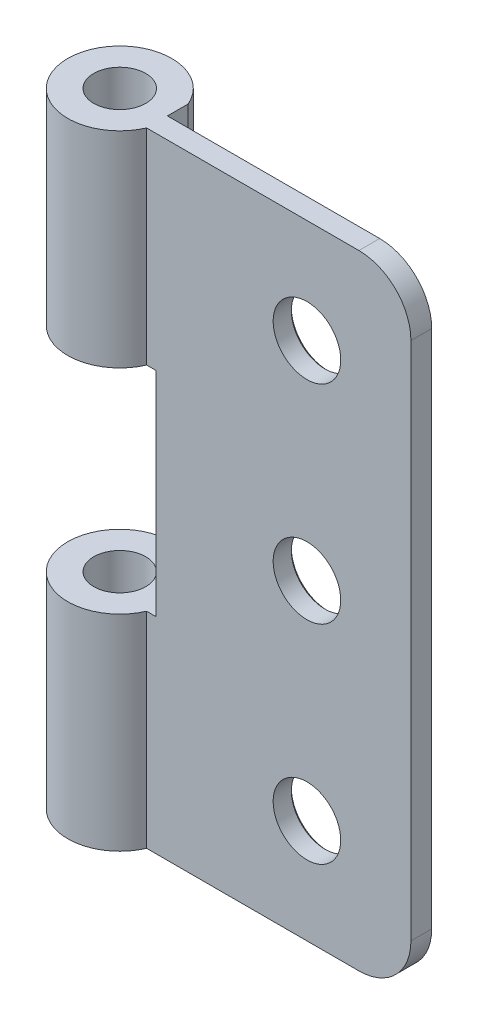
ISO-10303-21;
HEADER;
FILE_DESCRIPTION(('STEP AP214'),'2;1');
FILE_NAME('part.step','',(''),(''),'','','');
FILE_SCHEMA(('AUTOMOTIVE_DESIGN { 1 0 10303 214 1 1 1 1 }'));
ENDSEC;
DATA;
#1=APPLICATION_CONTEXT('core data for automotive mechanical design processes');
#2=APPLICATION_PROTOCOL_DEFINITION('international standard','automotive_design',2000,#1);
#3=PRODUCT_CONTEXT('',#1,'mechanical');
#4=PRODUCT('Part','Part','',(#3));
#5=PRODUCT_RELATED_PRODUCT_CATEGORY('part','',(#4));
#6=PRODUCT_DEFINITION_FORMATION('','',#4);
#7=PRODUCT_DEFINITION_CONTEXT('part definition',#1,'design');
#8=PRODUCT_DEFINITION('design','',#6,#7);
#9=PRODUCT_DEFINITION_SHAPE('','',#8);
#10=(LENGTH_UNIT() NAMED_UNIT(*) SI_UNIT(.MILLI.,.METRE.));
#11=(NAMED_UNIT(*) PLANE_ANGLE_UNIT() SI_UNIT($,.RADIAN.));
#12=(NAMED_UNIT(*) SI_UNIT($,.STERADIAN.) SOLID_ANGLE_UNIT());
#13=UNCERTAINTY_MEASURE_WITH_UNIT(LENGTH_MEASURE(1.E-05),#10,'distance_accuracy_value','');
#14=(GEOMETRIC_REPRESENTATION_CONTEXT(3) GLOBAL_UNCERTAINTY_ASSIGNED_CONTEXT((#13)) GLOBAL_UNIT_ASSIGNED_CONTEXT((#10,
#11,#12)) REPRESENTATION_CONTEXT('',''));
#15=CARTESIAN_POINT('',(0.,0.,0.));
#16=DIRECTION('',(0.,0.,1.));
#17=DIRECTION('',(1.,0.,0.));
#18=AXIS2_PLACEMENT_3D('',#15,#16,#17);
#19=CARTESIAN_POINT('',(0.,30.,0.));
#20=DIRECTION('',(0.,0.,-1.));
#21=DIRECTION('',(-1.,0.,0.));
#22=AXIS2_PLACEMENT_3D('',#19,#20,#21);
#23=PLANE('',#22);
#24=CARTESIAN_POINT('',(20.,-20.,0.));
#25=DIRECTION('',(0.,0.,-1.));
#26=DIRECTION('',(-1.,0.,0.));
#27=AXIS2_PLACEMENT_3D('',#24,#25,#26);
#28=CIRCLE('',#27,3.5);
#29=CARTESIAN_POINT('',(16.5,-20.,0.));
#30=VERTEX_POINT('',#29);
#31=EDGE_CURVE('E318',#30,#30,#28,.T.);
#32=ORIENTED_EDGE('',*,*,#31,.F.);
#33=EDGE_LOOP('',(#32));
#34=FACE_BOUND('',#33,.T.);
#35=CARTESIAN_POINT('',(20.,0.,0.));
#36=DIRECTION('',(0.,0.,-1.));
#37=DIRECTION('',(-1.,0.,0.));
#38=AXIS2_PLACEMENT_3D('',#35,#36,#37);
#39=CIRCLE('',#38,3.5);
#40=CARTESIAN_POINT('',(16.5,0.,0.));
#41=VERTEX_POINT('',#40);
#42=EDGE_CURVE('E171',#41,#41,#39,.T.);
#43=ORIENTED_EDGE('',*,*,#42,.F.);
#44=EDGE_LOOP('',(#43));
#45=FACE_BOUND('',#44,.T.);
#46=CARTESIAN_POINT('',(20.,20.,0.));
#47=DIRECTION('',(0.,0.,-1.));
#48=DIRECTION('',(-1.,0.,0.));
#49=AXIS2_PLACEMENT_3D('',#46,#47,#48);
#50=CIRCLE('',#49,3.5);
#51=CARTESIAN_POINT('',(16.5,20.,0.));
#52=VERTEX_POINT('',#51);
#53=EDGE_CURVE('E166',#52,#52,#50,.T.);
#54=ORIENTED_EDGE('',*,*,#53,.F.);
#55=EDGE_LOOP('',(#54));
#56=FACE_BOUND('',#55,.T.);
#57=DIRECTION('',(1.,0.,0.));
#58=VECTOR('',#57,1.);
#59=CARTESIAN_POINT('',(0.,30.,0.));
#60=LINE('',#59,#58);
#61=CARTESIAN_POINT('',(4.58257569495584,30.,0.));
#62=VERTEX_POINT('',#61);
#63=CARTESIAN_POINT('',(25.,30.,0.));
#64=VERTEX_POINT('',#63);
#65=EDGE_CURVE('E185',#62,#64,#60,.T.);
#66=ORIENTED_EDGE('',*,*,#65,.T.);
#67=CARTESIAN_POINT('',(25.,25.,0.));
#68=DIRECTION('',(0.,0.,-1.));
#69=DIRECTION('',(-1.,0.,0.));
#70=AXIS2_PLACEMENT_3D('',#67,#68,#69);
#71=CIRCLE('',#70,5.);
#72=CARTESIAN_POINT('',(30.,25.,0.));
#73=VERTEX_POINT('',#72);
#74=EDGE_CURVE('E42',#64,#73,#71,.T.);
#75=ORIENTED_EDGE('',*,*,#74,.T.);
#76=DIRECTION('',(0.,-1.,0.));
#77=VECTOR('',#76,1.);
#78=CARTESIAN_POINT('',(30.,30.,0.));
#79=LINE('',#78,#77);
#80=CARTESIAN_POINT('',(30.,-25.,0.));
#81=VERTEX_POINT('',#80);
#82=EDGE_CURVE('E184',#73,#81,#79,.T.);
#83=ORIENTED_EDGE('',*,*,#82,.T.);
#84=CARTESIAN_POINT('',(25.,-25.,0.));
#85=DIRECTION('',(0.,0.,-1.));
#86=DIRECTION('',(-1.,0.,0.));
#87=AXIS2_PLACEMENT_3D('',#84,#85,#86);
#88=CIRCLE('',#87,5.);
#89=CARTESIAN_POINT('',(25.,-30.,0.));
#90=VERTEX_POINT('',#89);
#91=EDGE_CURVE('E49',#81,#90,#88,.T.);
#92=ORIENTED_EDGE('',*,*,#91,.T.);
#93=DIRECTION('',(1.,0.,0.));
#94=VECTOR('',#93,1.);
#95=CARTESIAN_POINT('',(0.,-30.,0.));
#96=LINE('',#95,#94);
#97=CARTESIAN_POINT('',(4.58257569495584,-30.,0.));
#98=VERTEX_POINT('',#97);
#99=EDGE_CURVE('E147',#98,#90,#96,.T.);
#100=ORIENTED_EDGE('',*,*,#99,.F.);
#101=DIRECTION('',(0.,-1.,0.));
#102=VECTOR('',#101,1.);
#103=CARTESIAN_POINT('',(4.58257569495584,30.,0.));
#104=LINE('',#103,#102);
#105=CARTESIAN_POINT('',(4.58257569495584,-10.25,0.));
#106=VERTEX_POINT('',#105);
#107=EDGE_CURVE('E143',#106,#98,#104,.T.);
#108=ORIENTED_EDGE('',*,*,#107,.F.);
#109=DIRECTION('',(1.,0.,0.));
#110=VECTOR('',#109,1.);
#111=CARTESIAN_POINT('',(0.,-10.25,0.));
#112=LINE('',#111,#110);
#113=CARTESIAN_POINT('',(5.5,-10.25,0.));
#114=VERTEX_POINT('',#113);
#115=EDGE_CURVE('E126',#106,#114,#112,.T.);
#116=ORIENTED_EDGE('',*,*,#115,.T.);
#117=DIRECTION('',(0.,1.,0.));
#118=VECTOR('',#117,1.);
#119=CARTESIAN_POINT('',(5.5,-10.25,0.));
#120=LINE('',#119,#118);
#121=CARTESIAN_POINT('',(5.5,10.25,0.));
#122=VERTEX_POINT('',#121);
#123=EDGE_CURVE('E217',#114,#122,#120,.T.);
#124=ORIENTED_EDGE('',*,*,#123,.T.);
#125=DIRECTION('',(1.,0.,0.));
#126=VECTOR('',#125,1.);
#127=CARTESIAN_POINT('',(0.,10.25,0.));
#128=LINE('',#127,#126);
#129=CARTESIAN_POINT('',(4.58257569495584,10.25,0.));
#130=VERTEX_POINT('',#129);
#131=EDGE_CURVE('E161',#130,#122,#128,.T.);
#132=ORIENTED_EDGE('',*,*,#131,.F.);
#133=EDGE_CURVE('E149',#62,#130,#104,.T.);
#134=ORIENTED_EDGE('',*,*,#133,.F.);
#135=EDGE_LOOP('',(#66,#75,#83,#92,#100,#108,#116,#124,#132,#134));
#136=FACE_BOUND('',#135,.T.);
#137=ADVANCED_FACE('F34',(#34,#45,#56,#136),#23,.T.);
#138=CARTESIAN_POINT('',(4.58257569495584,30.,0.));
#139=DIRECTION('',(1.,0.,0.));
#140=DIRECTION('',(0.,0.,-1.));
#141=AXIS2_PLACEMENT_3D('',#138,#139,#140);
#142=PLANE('',#141);
#143=DIRECTION('',(0.,-1.,0.));
#144=VECTOR('',#143,1.);
#145=CARTESIAN_POINT('',(4.58257569495584,30.,-2.));
#146=LINE('',#145,#144);
#147=CARTESIAN_POINT('',(4.58257569495584,-10.25,-2.));
#148=VERTEX_POINT('',#147);
#149=CARTESIAN_POINT('',(4.58257569495584,-30.,-2.));
#150=VERTEX_POINT('',#149);
#151=EDGE_CURVE('E144',#148,#150,#146,.T.);
#152=ORIENTED_EDGE('',*,*,#151,.F.);
#153=DIRECTION('',(0.,0.,1.));
#154=VECTOR('',#153,1.);
#155=CARTESIAN_POINT('',(4.58257569495584,-10.25,0.));
#156=LINE('',#155,#154);
#157=EDGE_CURVE('E130',#148,#106,#156,.T.);
#158=ORIENTED_EDGE('',*,*,#157,.T.);
#159=ORIENTED_EDGE('',*,*,#107,.T.);
#160=DIRECTION('',(0.,0.,1.));
#161=VECTOR('',#160,1.);
#162=CARTESIAN_POINT('',(4.58257569495584,-30.,0.));
#163=LINE('',#162,#161);
#164=EDGE_CURVE('E216',#150,#98,#163,.T.);
#165=ORIENTED_EDGE('',*,*,#164,.F.);
#166=EDGE_LOOP('',(#152,#158,#159,#165));
#167=FACE_BOUND('',#166,.T.);
#168=ADVANCED_FACE('F141',(#167),#142,.T.);
#169=CARTESIAN_POINT('',(0.,30.,0.));
#170=DIRECTION('',(0.,-1.,0.));
#171=DIRECTION('',(0.,0.,-1.));
#172=AXIS2_PLACEMENT_3D('',#169,#170,#171);
#173=CYLINDRICAL_SURFACE('',#172,5.);
#174=CARTESIAN_POINT('',(0.,-10.25,0.));
#175=DIRECTION('',(0.,1.,0.));
#176=DIRECTION('',(0.,0.,1.));
#177=AXIS2_PLACEMENT_3D('',#174,#175,#176);
#178=CIRCLE('',#177,5.);
#179=CARTESIAN_POINT('',(4.58257569495584,-10.25,2.));
#180=VERTEX_POINT('',#179);
#181=EDGE_CURVE('E145',#148,#180,#178,.T.);
#182=ORIENTED_EDGE('',*,*,#181,.F.);
#183=ORIENTED_EDGE('',*,*,#151,.T.);
#184=CARTESIAN_POINT('',(0.,-30.,0.));
#185=DIRECTION('',(0.,1.,0.));
#186=DIRECTION('',(0.,0.,1.));
#187=AXIS2_PLACEMENT_3D('',#184,#185,#186);
#188=CIRCLE('',#187,5.);
#189=CARTESIAN_POINT('',(4.58257569495584,-30.,2.));
#190=VERTEX_POINT('',#189);
#191=EDGE_CURVE('E219',#150,#190,#188,.T.);
#192=ORIENTED_EDGE('',*,*,#191,.T.);
#193=DIRECTION('',(0.,-1.,0.));
#194=VECTOR('',#193,1.);
#195=CARTESIAN_POINT('',(4.58257569495584,30.,2.));
#196=LINE('',#195,#194);
#197=EDGE_CURVE('E227',#180,#190,#196,.T.);
#198=ORIENTED_EDGE('',*,*,#197,.F.);
#199=EDGE_LOOP('',(#182,#183,#192,#198));
#200=FACE_BOUND('',#199,.T.);
#201=ADVANCED_FACE('F238',(#200),#173,.T.);
#202=CARTESIAN_POINT('',(0.,30.,2.));
#203=DIRECTION('',(0.,0.,1.));
#204=DIRECTION('',(1.,0.,0.));
#205=AXIS2_PLACEMENT_3D('',#202,#203,#204);
#206=PLANE('',#205);
#207=CARTESIAN_POINT('',(20.,-20.,2.));
#208=DIRECTION('',(0.,0.,1.));
#209=DIRECTION('',(1.,0.,0.));
#210=AXIS2_PLACEMENT_3D('',#207,#208,#209);
#211=CIRCLE('',#210,3.25);
#212=CARTESIAN_POINT('',(23.25,-20.,2.));
#213=VERTEX_POINT('',#212);
#214=EDGE_CURVE('E168',#213,#213,#211,.T.);
#215=ORIENTED_EDGE('',*,*,#214,.F.);
#216=EDGE_LOOP('',(#215));
#217=FACE_BOUND('',#216,.T.);
#218=CARTESIAN_POINT('',(20.,0.,2.));
#219=DIRECTION('',(0.,0.,1.));
#220=DIRECTION('',(1.,0.,0.));
#221=AXIS2_PLACEMENT_3D('',#218,#219,#220);
#222=CIRCLE('',#221,3.25);
#223=CARTESIAN_POINT('',(23.25,0.,2.));
#224=VERTEX_POINT('',#223);
#225=EDGE_CURVE('E163',#224,#224,#222,.T.);
#226=ORIENTED_EDGE('',*,*,#225,.F.);
#227=EDGE_LOOP('',(#226));
#228=FACE_BOUND('',#227,.T.);
#229=CARTESIAN_POINT('',(20.,20.,2.));
#230=DIRECTION('',(0.,0.,1.));
#231=DIRECTION('',(1.,0.,0.));
#232=AXIS2_PLACEMENT_3D('',#229,#230,#231);
#233=CIRCLE('',#232,3.25);
#234=CARTESIAN_POINT('',(23.25,20.,2.));
#235=VERTEX_POINT('',#234);
#236=EDGE_CURVE('E158',#235,#235,#233,.T.);
#237=ORIENTED_EDGE('',*,*,#236,.F.);
#238=EDGE_LOOP('',(#237));
#239=FACE_BOUND('',#238,.T.);
#240=DIRECTION('',(0.,-1.,0.));
#241=VECTOR('',#240,1.);
#242=CARTESIAN_POINT('',(30.,30.,2.));
#243=LINE('',#242,#241);
#244=CARTESIAN_POINT('',(30.,25.,2.));
#245=VERTEX_POINT('',#244);
#246=CARTESIAN_POINT('',(30.,-25.,2.));
#247=VERTEX_POINT('',#246);
#248=EDGE_CURVE('E193',#245,#247,#243,.T.);
#249=ORIENTED_EDGE('',*,*,#248,.F.);
#250=CARTESIAN_POINT('',(25.,25.,2.));
#251=DIRECTION('',(0.,0.,1.));
#252=DIRECTION('',(1.,0.,0.));
#253=AXIS2_PLACEMENT_3D('',#250,#251,#252);
#254=CIRCLE('',#253,5.);
#255=CARTESIAN_POINT('',(25.,30.,2.));
#256=VERTEX_POINT('',#255);
#257=EDGE_CURVE('E179',#245,#256,#254,.T.);
#258=ORIENTED_EDGE('',*,*,#257,.T.);
#259=DIRECTION('',(-1.,0.,0.));
#260=VECTOR('',#259,1.);
#261=CARTESIAN_POINT('',(0.,30.,2.));
#262=LINE('',#261,#260);
#263=CARTESIAN_POINT('',(4.58257569495584,30.,2.));
#264=VERTEX_POINT('',#263);
#265=EDGE_CURVE('E200',#256,#264,#262,.T.);
#266=ORIENTED_EDGE('',*,*,#265,.T.);
#267=CARTESIAN_POINT('',(4.58257569495584,10.25,2.));
#268=VERTEX_POINT('',#267);
#269=EDGE_CURVE('E228',#264,#268,#196,.T.);
#270=ORIENTED_EDGE('',*,*,#269,.T.);
#271=DIRECTION('',(-1.,0.,0.));
#272=VECTOR('',#271,1.);
#273=CARTESIAN_POINT('',(0.,10.25,2.));
#274=LINE('',#273,#272);
#275=CARTESIAN_POINT('',(5.5,10.25,2.));
#276=VERTEX_POINT('',#275);
#277=EDGE_CURVE('E344',#276,#268,#274,.T.);
#278=ORIENTED_EDGE('',*,*,#277,.F.);
#279=DIRECTION('',(0.,1.,0.));
#280=VECTOR('',#279,1.);
#281=CARTESIAN_POINT('',(5.5,-10.25,2.));
#282=LINE('',#281,#280);
#283=CARTESIAN_POINT('',(5.5,-10.25,2.));
#284=VERTEX_POINT('',#283);
#285=EDGE_CURVE('E336',#284,#276,#282,.T.);
#286=ORIENTED_EDGE('',*,*,#285,.F.);
#287=DIRECTION('',(-1.,0.,0.));
#288=VECTOR('',#287,1.);
#289=CARTESIAN_POINT('',(0.,-10.25,2.));
#290=LINE('',#289,#288);
#291=EDGE_CURVE('E235',#284,#180,#290,.T.);
#292=ORIENTED_EDGE('',*,*,#291,.T.);
#293=ORIENTED_EDGE('',*,*,#197,.T.);
#294=DIRECTION('',(-1.,0.,0.));
#295=VECTOR('',#294,1.);
#296=CARTESIAN_POINT('',(0.,-30.,2.));
#297=LINE('',#296,#295);
#298=CARTESIAN_POINT('',(25.,-30.,2.));
#299=VERTEX_POINT('',#298);
#300=EDGE_CURVE('E222',#299,#190,#297,.T.);
#301=ORIENTED_EDGE('',*,*,#300,.F.);
#302=CARTESIAN_POINT('',(25.,-25.,2.));
#303=DIRECTION('',(0.,0.,1.));
#304=DIRECTION('',(1.,0.,0.));
#305=AXIS2_PLACEMENT_3D('',#302,#303,#304);
#306=CIRCLE('',#305,5.);
#307=EDGE_CURVE('E177',#299,#247,#306,.T.);
#308=ORIENTED_EDGE('',*,*,#307,.T.);
#309=EDGE_LOOP('',(#249,#258,#266,#270,#278,#286,#292,#293,#301,#308));
#310=FACE_BOUND('',#309,.T.);
#311=ADVANCED_FACE('F198',(#217,#228,#239,#310),#206,.T.);
#312=CARTESIAN_POINT('',(0.,30.,0.));
#313=DIRECTION('',(0.,-1.,0.));
#314=DIRECTION('',(0.,0.,-1.));
#315=AXIS2_PLACEMENT_3D('',#312,#313,#314);
#316=CYLINDRICAL_SURFACE('',#315,2.5);
#317=CARTESIAN_POINT('',(0.,-30.,0.));
#318=DIRECTION('',(0.,1.,0.));
#319=DIRECTION('',(0.,0.,1.));
#320=AXIS2_PLACEMENT_3D('',#317,#318,#319);
#321=CIRCLE('',#320,2.5);
#322=CARTESIAN_POINT('',(0.,-30.,2.5));
#323=VERTEX_POINT('',#322);
#324=EDGE_CURVE('E224',#323,#323,#321,.T.);
#325=ORIENTED_EDGE('',*,*,#324,.F.);
#326=EDGE_LOOP('',(#325));
#327=FACE_BOUND('',#326,.T.);
#328=CARTESIAN_POINT('',(0.,-10.25,0.));
#329=DIRECTION('',(0.,1.,0.));
#330=DIRECTION('',(0.,0.,1.));
#331=AXIS2_PLACEMENT_3D('',#328,#329,#330);
#332=CIRCLE('',#331,2.5);
#333=CARTESIAN_POINT('',(0.,-10.25,2.5));
#334=VERTEX_POINT('',#333);
#335=EDGE_CURVE('E333',#334,#334,#332,.T.);
#336=ORIENTED_EDGE('',*,*,#335,.T.);
#337=EDGE_LOOP('',(#336));
#338=FACE_BOUND('',#337,.T.);
#339=ADVANCED_FACE('F262',(#327,#338),#316,.F.);
#340=DIRECTION('',(0.,0.,1.));
#341=VECTOR('',#340,1.);
#342=CARTESIAN_POINT('',(4.58257569495584,10.25,0.));
#343=LINE('',#342,#341);
#344=CARTESIAN_POINT('',(4.58257569495584,10.25,-2.));
#345=VERTEX_POINT('',#344);
#346=EDGE_CURVE('E339',#345,#130,#343,.T.);
#347=ORIENTED_EDGE('',*,*,#346,.F.);
#348=CARTESIAN_POINT('',(4.58257569495584,30.,-2.));
#349=VERTEX_POINT('',#348);
#350=EDGE_CURVE('E150',#349,#345,#146,.T.);
#351=ORIENTED_EDGE('',*,*,#350,.F.);
#352=DIRECTION('',(0.,0.,1.));
#353=VECTOR('',#352,1.);
#354=CARTESIAN_POINT('',(4.58257569495584,30.,0.));
#355=LINE('',#354,#353);
#356=EDGE_CURVE('E211',#349,#62,#355,.T.);
#357=ORIENTED_EDGE('',*,*,#356,.T.);
#358=ORIENTED_EDGE('',*,*,#133,.T.);
#359=EDGE_LOOP('',(#347,#351,#357,#358));
#360=FACE_BOUND('',#359,.T.);
#361=ADVANCED_FACE('F256',(#360),#142,.T.);
#362=ORIENTED_EDGE('',*,*,#350,.T.);
#363=CARTESIAN_POINT('',(0.,10.25,0.));
#364=DIRECTION('',(0.,1.,0.));
#365=DIRECTION('',(0.,0.,1.));
#366=AXIS2_PLACEMENT_3D('',#363,#364,#365);
#367=CIRCLE('',#366,5.);
#368=EDGE_CURVE('E341',#345,#268,#367,.T.);
#369=ORIENTED_EDGE('',*,*,#368,.T.);
#370=ORIENTED_EDGE('',*,*,#269,.F.);
#371=CARTESIAN_POINT('',(0.,30.,0.));
#372=DIRECTION('',(0.,1.,0.));
#373=DIRECTION('',(0.,0.,1.));
#374=AXIS2_PLACEMENT_3D('',#371,#372,#373);
#375=CIRCLE('',#374,5.);
#376=EDGE_CURVE('E206',#349,#264,#375,.T.);
#377=ORIENTED_EDGE('',*,*,#376,.F.);
#378=EDGE_LOOP('',(#362,#369,#370,#377));
#379=FACE_BOUND('',#378,.T.);
#380=ADVANCED_FACE('F261',(#379),#173,.T.);
#381=CARTESIAN_POINT('',(30.,30.,0.));
#382=DIRECTION('',(1.,0.,0.));
#383=DIRECTION('',(0.,0.,-1.));
#384=AXIS2_PLACEMENT_3D('',#381,#382,#383);
#385=PLANE('',#384);
#386=ORIENTED_EDGE('',*,*,#82,.F.);
#387=DIRECTION('',(0.,0.,1.));
#388=VECTOR('',#387,1.);
#389=CARTESIAN_POINT('',(30.,25.,0.));
#390=LINE('',#389,#388);
#391=EDGE_CURVE('E174',#73,#245,#390,.T.);
#392=ORIENTED_EDGE('',*,*,#391,.T.);
#393=ORIENTED_EDGE('',*,*,#248,.T.);
#394=DIRECTION('',(0.,0.,1.));
#395=VECTOR('',#394,1.);
#396=CARTESIAN_POINT('',(30.,-25.,0.));
#397=LINE('',#396,#395);
#398=EDGE_CURVE('E153',#247,#81,#397,.F.);
#399=ORIENTED_EDGE('',*,*,#398,.T.);
#400=EDGE_LOOP('',(#386,#392,#393,#399));
#401=FACE_BOUND('',#400,.T.);
#402=ADVANCED_FACE('F189',(#401),#385,.T.);
#403=CARTESIAN_POINT('',(0.,10.25,0.));
#404=DIRECTION('',(0.,1.,0.));
#405=DIRECTION('',(0.,0.,1.));
#406=AXIS2_PLACEMENT_3D('',#403,#404,#405);
#407=CIRCLE('',#406,2.5);
#408=CARTESIAN_POINT('',(0.,10.25,2.5));
#409=VERTEX_POINT('',#408);
#410=EDGE_CURVE('E137',#409,#409,#407,.T.);
#411=ORIENTED_EDGE('',*,*,#410,.F.);
#412=EDGE_LOOP('',(#411));
#413=FACE_BOUND('',#412,.T.);
#414=CARTESIAN_POINT('',(0.,30.,0.));
#415=DIRECTION('',(0.,1.,0.));
#416=DIRECTION('',(0.,0.,1.));
#417=AXIS2_PLACEMENT_3D('',#414,#415,#416);
#418=CIRCLE('',#417,2.5);
#419=CARTESIAN_POINT('',(0.,30.,2.5));
#420=VERTEX_POINT('',#419);
#421=EDGE_CURVE('E194',#420,#420,#418,.T.);
#422=ORIENTED_EDGE('',*,*,#421,.T.);
#423=EDGE_LOOP('',(#422));
#424=FACE_BOUND('',#423,.T.);
#425=ADVANCED_FACE('F272',(#413,#424),#316,.F.);
#426=CARTESIAN_POINT('',(0.,30.,0.));
#427=DIRECTION('',(0.,1.,0.));
#428=DIRECTION('',(0.,0.,1.));
#429=AXIS2_PLACEMENT_3D('',#426,#427,#428);
#430=PLANE('',#429);
#431=ORIENTED_EDGE('',*,*,#265,.F.);
#432=DIRECTION('',(0.,0.,1.));
#433=VECTOR('',#432,1.);
#434=CARTESIAN_POINT('',(25.,30.,0.));
#435=LINE('',#434,#433);
#436=EDGE_CURVE('E57',#256,#64,#435,.F.);
#437=ORIENTED_EDGE('',*,*,#436,.T.);
#438=ORIENTED_EDGE('',*,*,#65,.F.);
#439=ORIENTED_EDGE('',*,*,#356,.F.);
#440=ORIENTED_EDGE('',*,*,#376,.T.);
#441=EDGE_LOOP('',(#431,#437,#438,#439,#440));
#442=FACE_BOUND('',#441,.T.);
#443=ORIENTED_EDGE('',*,*,#421,.F.);
#444=EDGE_LOOP('',(#443));
#445=FACE_BOUND('',#444,.T.);
#446=ADVANCED_FACE('F202',(#442,#445),#430,.T.);
#447=CARTESIAN_POINT('',(0.,-30.,0.));
#448=DIRECTION('',(0.,1.,0.));
#449=DIRECTION('',(0.,0.,1.));
#450=AXIS2_PLACEMENT_3D('',#447,#448,#449);
#451=PLANE('',#450);
#452=ORIENTED_EDGE('',*,*,#99,.T.);
#453=DIRECTION('',(0.,0.,1.));
#454=VECTOR('',#453,1.);
#455=CARTESIAN_POINT('',(25.,-30.,2.));
#456=LINE('',#455,#454);
#457=EDGE_CURVE('E11',#90,#299,#456,.T.);
#458=ORIENTED_EDGE('',*,*,#457,.T.);
#459=ORIENTED_EDGE('',*,*,#300,.T.);
#460=ORIENTED_EDGE('',*,*,#191,.F.);
#461=ORIENTED_EDGE('',*,*,#164,.T.);
#462=EDGE_LOOP('',(#452,#458,#459,#460,#461));
#463=FACE_BOUND('',#462,.T.);
#464=ORIENTED_EDGE('',*,*,#324,.T.);
#465=EDGE_LOOP('',(#464));
#466=FACE_BOUND('',#465,.T.);
#467=ADVANCED_FACE('F240',(#463,#466),#451,.F.);
#468=CARTESIAN_POINT('',(5.5,-10.25,0.));
#469=DIRECTION('',(-1.,0.,0.));
#470=DIRECTION('',(0.,0.,1.));
#471=AXIS2_PLACEMENT_3D('',#468,#469,#470);
#472=PLANE('',#471);
#473=DIRECTION('',(0.,0.,1.));
#474=VECTOR('',#473,1.);
#475=CARTESIAN_POINT('',(5.5,10.25,0.));
#476=LINE('',#475,#474);
#477=EDGE_CURVE('E346',#122,#276,#476,.T.);
#478=ORIENTED_EDGE('',*,*,#477,.F.);
#479=ORIENTED_EDGE('',*,*,#123,.F.);
#480=DIRECTION('',(0.,0.,1.));
#481=VECTOR('',#480,1.);
#482=CARTESIAN_POINT('',(5.5,-10.25,0.));
#483=LINE('',#482,#481);
#484=EDGE_CURVE('E133',#114,#284,#483,.T.);
#485=ORIENTED_EDGE('',*,*,#484,.T.);
#486=ORIENTED_EDGE('',*,*,#285,.T.);
#487=EDGE_LOOP('',(#478,#479,#485,#486));
#488=FACE_BOUND('',#487,.T.);
#489=ADVANCED_FACE('F278',(#488),#472,.T.);
#490=CARTESIAN_POINT('',(0.,-10.25,0.));
#491=DIRECTION('',(0.,1.,0.));
#492=DIRECTION('',(0.,0.,1.));
#493=AXIS2_PLACEMENT_3D('',#490,#491,#492);
#494=PLANE('',#493);
#495=ORIENTED_EDGE('',*,*,#115,.F.);
#496=ORIENTED_EDGE('',*,*,#157,.F.);
#497=ORIENTED_EDGE('',*,*,#181,.T.);
#498=ORIENTED_EDGE('',*,*,#291,.F.);
#499=ORIENTED_EDGE('',*,*,#484,.F.);
#500=EDGE_LOOP('',(#495,#496,#497,#498,#499));
#501=FACE_BOUND('',#500,.T.);
#502=ORIENTED_EDGE('',*,*,#335,.F.);
#503=EDGE_LOOP('',(#502));
#504=FACE_BOUND('',#503,.T.);
#505=ADVANCED_FACE('F128',(#501,#504),#494,.T.);
#506=CARTESIAN_POINT('',(0.,10.25,0.));
#507=DIRECTION('',(0.,1.,0.));
#508=DIRECTION('',(0.,0.,1.));
#509=AXIS2_PLACEMENT_3D('',#506,#507,#508);
#510=PLANE('',#509);
#511=ORIENTED_EDGE('',*,*,#131,.T.);
#512=ORIENTED_EDGE('',*,*,#477,.T.);
#513=ORIENTED_EDGE('',*,*,#277,.T.);
#514=ORIENTED_EDGE('',*,*,#368,.F.);
#515=ORIENTED_EDGE('',*,*,#346,.T.);
#516=EDGE_LOOP('',(#511,#512,#513,#514,#515));
#517=FACE_BOUND('',#516,.T.);
#518=ORIENTED_EDGE('',*,*,#410,.T.);
#519=EDGE_LOOP('',(#518));
#520=FACE_BOUND('',#519,.T.);
#521=ADVANCED_FACE('F284',(#517,#520),#510,.F.);
#522=CARTESIAN_POINT('',(20.,20.,0.));
#523=DIRECTION('',(0.,0.,-1.));
#524=DIRECTION('',(-1.,0.,0.));
#525=AXIS2_PLACEMENT_3D('',#522,#523,#524);
#526=CYLINDRICAL_SURFACE('',#525,3.25);
#527=ORIENTED_EDGE('',*,*,#236,.T.);
#528=EDGE_LOOP('',(#527));
#529=FACE_BOUND('',#528,.T.);
#530=CARTESIAN_POINT('',(20.,20.,0.249999999999999));
#531=DIRECTION('',(0.,0.,-1.));
#532=DIRECTION('',(-1.,0.,0.));
#533=AXIS2_PLACEMENT_3D('',#530,#531,#532);
#534=CIRCLE('',#533,3.25);
#535=CARTESIAN_POINT('',(16.75,20.,0.249999999999999));
#536=VERTEX_POINT('',#535);
#537=EDGE_CURVE('E162',#536,#536,#534,.T.);
#538=ORIENTED_EDGE('',*,*,#537,.T.);
#539=EDGE_LOOP('',(#538));
#540=FACE_BOUND('',#539,.T.);
#541=ADVANCED_FACE('F287',(#529,#540),#526,.F.);
#542=CARTESIAN_POINT('',(20.,20.,0.));
#543=DIRECTION('',(0.,0.,-1.));
#544=DIRECTION('',(-1.,0.,0.));
#545=AXIS2_PLACEMENT_3D('',#542,#543,#544);
#546=CONICAL_SURFACE('',#545,3.5,0.78539816339745);
#547=ORIENTED_EDGE('',*,*,#537,.F.);
#548=EDGE_LOOP('',(#547));
#549=FACE_BOUND('',#548,.T.);
#550=ORIENTED_EDGE('',*,*,#53,.T.);
#551=EDGE_LOOP('',(#550));
#552=FACE_BOUND('',#551,.T.);
#553=ADVANCED_FACE('F293',(#549,#552),#546,.F.);
#554=CARTESIAN_POINT('',(20.,0.,0.));
#555=DIRECTION('',(0.,0.,-1.));
#556=DIRECTION('',(-1.,0.,0.));
#557=AXIS2_PLACEMENT_3D('',#554,#555,#556);
#558=CYLINDRICAL_SURFACE('',#557,3.25);
#559=ORIENTED_EDGE('',*,*,#225,.T.);
#560=EDGE_LOOP('',(#559));
#561=FACE_BOUND('',#560,.T.);
#562=CARTESIAN_POINT('',(20.,0.,0.249999999999999));
#563=DIRECTION('',(0.,0.,-1.));
#564=DIRECTION('',(-1.,0.,0.));
#565=AXIS2_PLACEMENT_3D('',#562,#563,#564);
#566=CIRCLE('',#565,3.25);
#567=CARTESIAN_POINT('',(16.75,0.,0.249999999999999));
#568=VERTEX_POINT('',#567);
#569=EDGE_CURVE('E167',#568,#568,#566,.T.);
#570=ORIENTED_EDGE('',*,*,#569,.T.);
#571=EDGE_LOOP('',(#570));
#572=FACE_BOUND('',#571,.T.);
#573=ADVANCED_FACE('F297',(#561,#572),#558,.F.);
#574=CARTESIAN_POINT('',(20.,0.,0.));
#575=DIRECTION('',(0.,0.,-1.));
#576=DIRECTION('',(-1.,0.,0.));
#577=AXIS2_PLACEMENT_3D('',#574,#575,#576);
#578=CONICAL_SURFACE('',#577,3.5,0.78539816339745);
#579=ORIENTED_EDGE('',*,*,#569,.F.);
#580=EDGE_LOOP('',(#579));
#581=FACE_BOUND('',#580,.T.);
#582=ORIENTED_EDGE('',*,*,#42,.T.);
#583=EDGE_LOOP('',(#582));
#584=FACE_BOUND('',#583,.T.);
#585=ADVANCED_FACE('F301',(#581,#584),#578,.F.);
#586=CARTESIAN_POINT('',(20.,-20.,0.));
#587=DIRECTION('',(0.,0.,-1.));
#588=DIRECTION('',(-1.,0.,0.));
#589=AXIS2_PLACEMENT_3D('',#586,#587,#588);
#590=CYLINDRICAL_SURFACE('',#589,3.25);
#591=ORIENTED_EDGE('',*,*,#214,.T.);
#592=EDGE_LOOP('',(#591));
#593=FACE_BOUND('',#592,.T.);
#594=CARTESIAN_POINT('',(20.,-20.,0.249999999999999));
#595=DIRECTION('',(0.,0.,-1.));
#596=DIRECTION('',(-1.,0.,0.));
#597=AXIS2_PLACEMENT_3D('',#594,#595,#596);
#598=CIRCLE('',#597,3.25);
#599=CARTESIAN_POINT('',(16.75,-20.,0.249999999999999));
#600=VERTEX_POINT('',#599);
#601=EDGE_CURVE('E172',#600,#600,#598,.T.);
#602=ORIENTED_EDGE('',*,*,#601,.T.);
#603=EDGE_LOOP('',(#602));
#604=FACE_BOUND('',#603,.T.);
#605=ADVANCED_FACE('F305',(#593,#604),#590,.F.);
#606=CARTESIAN_POINT('',(20.,-20.,0.));
#607=DIRECTION('',(0.,0.,-1.));
#608=DIRECTION('',(-1.,0.,0.));
#609=AXIS2_PLACEMENT_3D('',#606,#607,#608);
#610=CONICAL_SURFACE('',#609,3.5,0.78539816339745);
#611=ORIENTED_EDGE('',*,*,#601,.F.);
#612=EDGE_LOOP('',(#611));
#613=FACE_BOUND('',#612,.T.);
#614=ORIENTED_EDGE('',*,*,#31,.T.);
#615=EDGE_LOOP('',(#614));
#616=FACE_BOUND('',#615,.T.);
#617=ADVANCED_FACE('F248',(#613,#616),#610,.F.);
#618=CARTESIAN_POINT('',(25.,25.,0.));
#619=DIRECTION('',(0.,0.,1.));
#620=DIRECTION('',(1.,0.,0.));
#621=AXIS2_PLACEMENT_3D('',#618,#619,#620);
#622=CYLINDRICAL_SURFACE('',#621,5.);
#623=ORIENTED_EDGE('',*,*,#74,.F.);
#624=ORIENTED_EDGE('',*,*,#436,.F.);
#625=ORIENTED_EDGE('',*,*,#257,.F.);
#626=ORIENTED_EDGE('',*,*,#391,.F.);
#627=EDGE_LOOP('',(#623,#624,#625,#626));
#628=FACE_BOUND('',#627,.T.);
#629=ADVANCED_FACE('F196',(#628),#622,.T.);
#630=CARTESIAN_POINT('',(25.,-25.,0.));
#631=DIRECTION('',(0.,0.,-1.));
#632=DIRECTION('',(-1.,0.,0.));
#633=AXIS2_PLACEMENT_3D('',#630,#631,#632);
#634=CYLINDRICAL_SURFACE('',#633,5.);
#635=ORIENTED_EDGE('',*,*,#91,.F.);
#636=ORIENTED_EDGE('',*,*,#398,.F.);
#637=ORIENTED_EDGE('',*,*,#307,.F.);
#638=ORIENTED_EDGE('',*,*,#457,.F.);
#639=EDGE_LOOP('',(#635,#636,#637,#638));
#640=FACE_BOUND('',#639,.T.);
#641=ADVANCED_FACE('F36',(#640),#634,.T.);
#642=CLOSED_SHELL('',(#137,#168,#201,#311,#339,#361,#380,#402,#425,#446,#467,#489,#505,#521,
#541,#553,#573,#585,#605,#617,#629,#641));
#643=MANIFOLD_SOLID_BREP('B2',#642);
#644=ADVANCED_BREP_SHAPE_REPRESENTATION('',(#18,#643),#14);
#645=SHAPE_DEFINITION_REPRESENTATION(#9,#644);
ENDSEC;
END-ISO-10303-21;
